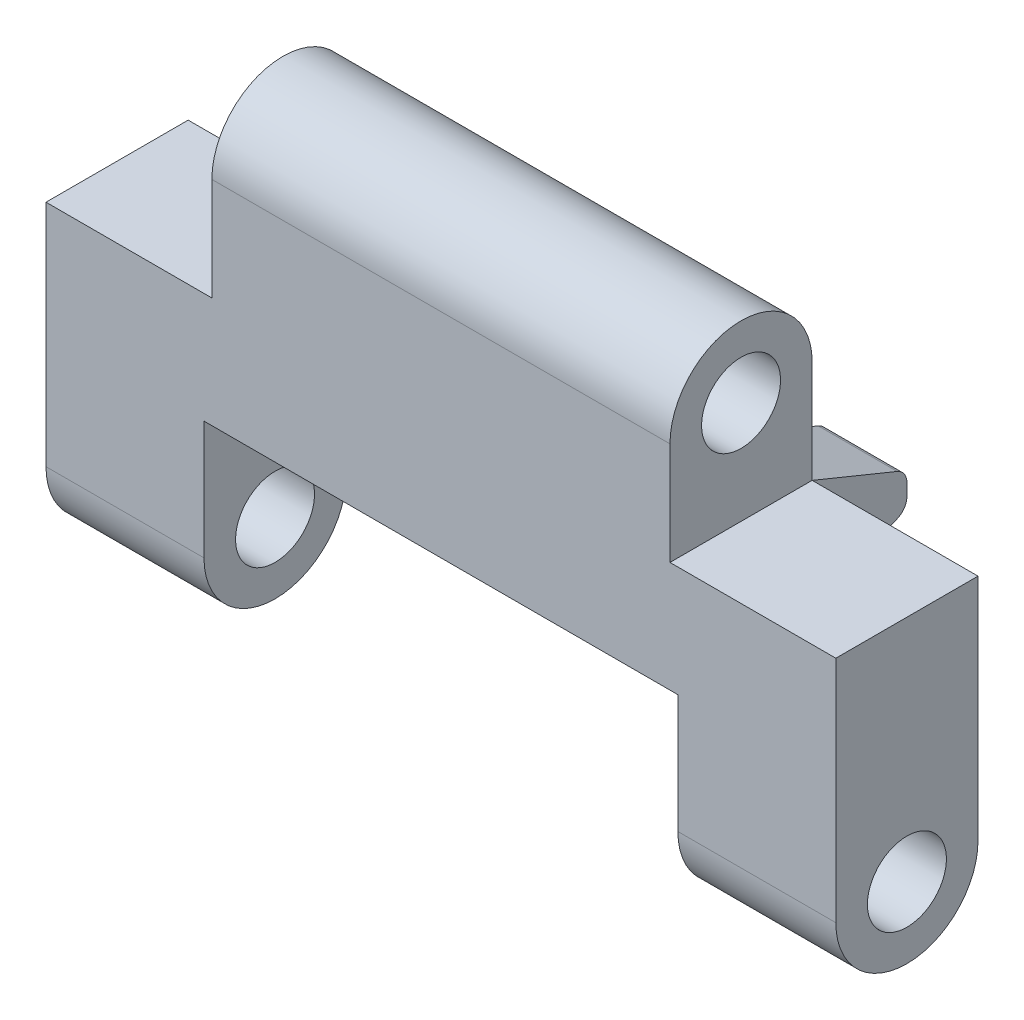
ISO-10303-21;
HEADER;
FILE_DESCRIPTION(('STEP AP214'),'2;1');
FILE_NAME('part.step','',(''),(''),'','','');
FILE_SCHEMA(('AUTOMOTIVE_DESIGN { 1 0 10303 214 1 1 1 1 }'));
ENDSEC;
DATA;
#1=APPLICATION_CONTEXT('core data for automotive mechanical design processes');
#2=APPLICATION_PROTOCOL_DEFINITION('international standard','automotive_design',2000,#1);
#3=PRODUCT_CONTEXT('',#1,'mechanical');
#4=PRODUCT('Part','Part','',(#3));
#5=PRODUCT_RELATED_PRODUCT_CATEGORY('part','',(#4));
#6=PRODUCT_DEFINITION_FORMATION('','',#4);
#7=PRODUCT_DEFINITION_CONTEXT('part definition',#1,'design');
#8=PRODUCT_DEFINITION('design','',#6,#7);
#9=PRODUCT_DEFINITION_SHAPE('','',#8);
#10=(LENGTH_UNIT() NAMED_UNIT(*) SI_UNIT(.MILLI.,.METRE.));
#11=(NAMED_UNIT(*) PLANE_ANGLE_UNIT() SI_UNIT($,.RADIAN.));
#12=(NAMED_UNIT(*) SI_UNIT($,.STERADIAN.) SOLID_ANGLE_UNIT());
#13=UNCERTAINTY_MEASURE_WITH_UNIT(LENGTH_MEASURE(1.E-05),#10,'distance_accuracy_value','');
#14=(GEOMETRIC_REPRESENTATION_CONTEXT(3) GLOBAL_UNCERTAINTY_ASSIGNED_CONTEXT((#13)) GLOBAL_UNIT_ASSIGNED_CONTEXT((#10,
#11,#12)) REPRESENTATION_CONTEXT('',''));
#15=CARTESIAN_POINT('',(0.,0.,0.));
#16=DIRECTION('',(0.,0.,1.));
#17=DIRECTION('',(1.,0.,0.));
#18=AXIS2_PLACEMENT_3D('',#15,#16,#17);
#19=CARTESIAN_POINT('',(0.,-19.,9.));
#20=DIRECTION('',(1.,0.,0.));
#21=DIRECTION('',(0.,0.,-1.));
#22=AXIS2_PLACEMENT_3D('',#19,#20,#21);
#23=PLANE('',#22);
#24=CARTESIAN_POINT('',(0.,-14.5,4.5));
#25=DIRECTION('',(-1.,0.,0.));
#26=DIRECTION('',(0.,0.,1.));
#27=AXIS2_PLACEMENT_3D('',#24,#25,#26);
#28=CIRCLE('',#27,2.5);
#29=CARTESIAN_POINT('',(0.,-14.5,7.));
#30=VERTEX_POINT('',#29);
#31=EDGE_CURVE('E255',#30,#30,#28,.T.);
#32=ORIENTED_EDGE('',*,*,#31,.F.);
#33=EDGE_LOOP('',(#32));
#34=FACE_BOUND('',#33,.T.);
#35=DIRECTION('',(0.,-1.,0.));
#36=VECTOR('',#35,1.);
#37=CARTESIAN_POINT('',(0.,-19.,0.));
#38=LINE('',#37,#36);
#39=CARTESIAN_POINT('',(0.,0.,0.));
#40=VERTEX_POINT('',#39);
#41=CARTESIAN_POINT('',(0.,-14.5,0.));
#42=VERTEX_POINT('',#41);
#43=EDGE_CURVE('E295',#40,#42,#38,.T.);
#44=ORIENTED_EDGE('',*,*,#43,.T.);
#45=CARTESIAN_POINT('',(0.,-14.5,4.5));
#46=DIRECTION('',(1.,0.,0.));
#47=DIRECTION('',(0.,0.,-1.));
#48=AXIS2_PLACEMENT_3D('',#45,#46,#47);
#49=CIRCLE('',#48,4.5);
#50=CARTESIAN_POINT('',(0.,-14.5,9.));
#51=VERTEX_POINT('',#50);
#52=EDGE_CURVE('E317',#42,#51,#49,.F.);
#53=ORIENTED_EDGE('',*,*,#52,.T.);
#54=DIRECTION('',(0.,-1.,0.));
#55=VECTOR('',#54,1.);
#56=CARTESIAN_POINT('',(0.,-19.,9.));
#57=LINE('',#56,#55);
#58=CARTESIAN_POINT('',(0.,0.,9.));
#59=VERTEX_POINT('',#58);
#60=EDGE_CURVE('E231',#59,#51,#57,.T.);
#61=ORIENTED_EDGE('',*,*,#60,.F.);
#62=DIRECTION('',(0.,0.,-1.));
#63=VECTOR('',#62,1.);
#64=CARTESIAN_POINT('',(0.,0.,9.));
#65=LINE('',#64,#63);
#66=EDGE_CURVE('E232',#59,#40,#65,.T.);
#67=ORIENTED_EDGE('',*,*,#66,.T.);
#68=EDGE_LOOP('',(#44,#53,#61,#67));
#69=FACE_BOUND('',#68,.T.);
#70=ADVANCED_FACE('F34',(#34,#69),#23,.F.);
#71=CARTESIAN_POINT('',(10.,-7.,9.));
#72=DIRECTION('',(-1.,0.,0.));
#73=DIRECTION('',(0.,-1.,0.));
#74=AXIS2_PLACEMENT_3D('',#71,#72,#73);
#75=PLANE('',#74);
#76=CARTESIAN_POINT('',(9.99999999999999,-14.5,4.5));
#77=DIRECTION('',(-1.,0.,0.));
#78=DIRECTION('',(0.,-1.,0.));
#79=AXIS2_PLACEMENT_3D('',#76,#77,#78);
#80=CIRCLE('',#79,2.5);
#81=CARTESIAN_POINT('',(9.99999999999999,-17.,4.5));
#82=VERTEX_POINT('',#81);
#83=EDGE_CURVE('E299',#82,#82,#80,.T.);
#84=ORIENTED_EDGE('',*,*,#83,.T.);
#85=EDGE_LOOP('',(#84));
#86=FACE_BOUND('',#85,.T.);
#87=DIRECTION('',(0.,1.,0.));
#88=VECTOR('',#87,1.);
#89=CARTESIAN_POINT('',(10.,-7.,9.));
#90=LINE('',#89,#88);
#91=CARTESIAN_POINT('',(10.,-14.5,9.));
#92=VERTEX_POINT('',#91);
#93=CARTESIAN_POINT('',(10.,-7.,9.));
#94=VERTEX_POINT('',#93);
#95=EDGE_CURVE('E285',#92,#94,#90,.T.);
#96=ORIENTED_EDGE('',*,*,#95,.F.);
#97=CARTESIAN_POINT('',(10.,-14.5,4.5));
#98=DIRECTION('',(-1.,0.,0.));
#99=DIRECTION('',(0.,-1.,0.));
#100=AXIS2_PLACEMENT_3D('',#97,#98,#99);
#101=CIRCLE('',#100,4.5);
#102=CARTESIAN_POINT('',(10.,-14.5,0.));
#103=VERTEX_POINT('',#102);
#104=EDGE_CURVE('E313',#92,#103,#101,.F.);
#105=ORIENTED_EDGE('',*,*,#104,.T.);
#106=DIRECTION('',(0.,1.,0.));
#107=VECTOR('',#106,1.);
#108=CARTESIAN_POINT('',(10.,-7.,0.));
#109=LINE('',#108,#107);
#110=CARTESIAN_POINT('',(10.,-7.,0.));
#111=VERTEX_POINT('',#110);
#112=EDGE_CURVE('E298',#103,#111,#109,.T.);
#113=ORIENTED_EDGE('',*,*,#112,.T.);
#114=DIRECTION('',(0.,0.,-1.));
#115=VECTOR('',#114,1.);
#116=CARTESIAN_POINT('',(10.,-7.,9.));
#117=LINE('',#116,#115);
#118=EDGE_CURVE('E247',#94,#111,#117,.T.);
#119=ORIENTED_EDGE('',*,*,#118,.F.);
#120=EDGE_LOOP('',(#96,#105,#113,#119));
#121=FACE_BOUND('',#120,.T.);
#122=ADVANCED_FACE('F417',(#86,#121),#75,.F.);
#123=CARTESIAN_POINT('',(40.,-19.,9.));
#124=DIRECTION('',(1.,0.,0.));
#125=DIRECTION('',(0.,1.,0.));
#126=AXIS2_PLACEMENT_3D('',#123,#124,#125);
#127=PLANE('',#126);
#128=CARTESIAN_POINT('',(40.,-14.5,4.5));
#129=DIRECTION('',(1.,0.,0.));
#130=DIRECTION('',(0.,1.,0.));
#131=AXIS2_PLACEMENT_3D('',#128,#129,#130);
#132=CIRCLE('',#131,2.5);
#133=CARTESIAN_POINT('',(40.,-12.,4.5));
#134=VERTEX_POINT('',#133);
#135=EDGE_CURVE('E259',#134,#134,#132,.T.);
#136=ORIENTED_EDGE('',*,*,#135,.T.);
#137=EDGE_LOOP('',(#136));
#138=FACE_BOUND('',#137,.T.);
#139=DIRECTION('',(0.,-1.,0.));
#140=VECTOR('',#139,1.);
#141=CARTESIAN_POINT('',(40.,-19.,0.));
#142=LINE('',#141,#140);
#143=CARTESIAN_POINT('',(40.,-6.99999999999999,0.));
#144=VERTEX_POINT('',#143);
#145=CARTESIAN_POINT('',(40.,-14.5,0.));
#146=VERTEX_POINT('',#145);
#147=EDGE_CURVE('E217',#144,#146,#142,.T.);
#148=ORIENTED_EDGE('',*,*,#147,.T.);
#149=CARTESIAN_POINT('',(40.,-14.5,4.5));
#150=DIRECTION('',(1.,0.,0.));
#151=DIRECTION('',(0.,1.,0.));
#152=AXIS2_PLACEMENT_3D('',#149,#150,#151);
#153=CIRCLE('',#152,4.5);
#154=CARTESIAN_POINT('',(40.,-14.5,9.));
#155=VERTEX_POINT('',#154);
#156=EDGE_CURVE('E206',#146,#155,#153,.F.);
#157=ORIENTED_EDGE('',*,*,#156,.T.);
#158=DIRECTION('',(0.,-1.,0.));
#159=VECTOR('',#158,1.);
#160=CARTESIAN_POINT('',(40.,-19.,9.));
#161=LINE('',#160,#159);
#162=CARTESIAN_POINT('',(40.,-6.99999999999999,9.));
#163=VERTEX_POINT('',#162);
#164=EDGE_CURVE('E277',#163,#155,#161,.T.);
#165=ORIENTED_EDGE('',*,*,#164,.F.);
#166=DIRECTION('',(0.,0.,-1.));
#167=VECTOR('',#166,1.);
#168=CARTESIAN_POINT('',(40.,-6.99999999999999,9.));
#169=LINE('',#168,#167);
#170=EDGE_CURVE('E244',#163,#144,#169,.T.);
#171=ORIENTED_EDGE('',*,*,#170,.T.);
#172=EDGE_LOOP('',(#148,#157,#165,#171));
#173=FACE_BOUND('',#172,.T.);
#174=ADVANCED_FACE('F312',(#138,#173),#127,.F.);
#175=CARTESIAN_POINT('',(50.,0.,9.));
#176=DIRECTION('',(-1.,0.,0.));
#177=DIRECTION('',(0.,0.,1.));
#178=AXIS2_PLACEMENT_3D('',#175,#176,#177);
#179=PLANE('',#178);
#180=CARTESIAN_POINT('',(50.,-14.5,4.5));
#181=DIRECTION('',(-1.,0.,0.));
#182=DIRECTION('',(0.,0.,1.));
#183=AXIS2_PLACEMENT_3D('',#180,#181,#182);
#184=CIRCLE('',#183,2.5);
#185=CARTESIAN_POINT('',(50.,-14.5,7.));
#186=VERTEX_POINT('',#185);
#187=EDGE_CURVE('E256',#186,#186,#184,.T.);
#188=ORIENTED_EDGE('',*,*,#187,.T.);
#189=EDGE_LOOP('',(#188));
#190=FACE_BOUND('',#189,.T.);
#191=DIRECTION('',(0.,1.,0.));
#192=VECTOR('',#191,1.);
#193=CARTESIAN_POINT('',(50.,0.,9.));
#194=LINE('',#193,#192);
#195=CARTESIAN_POINT('',(50.,-14.5,9.));
#196=VERTEX_POINT('',#195);
#197=CARTESIAN_POINT('',(50.,0.,9.));
#198=VERTEX_POINT('',#197);
#199=EDGE_CURVE('E200',#196,#198,#194,.T.);
#200=ORIENTED_EDGE('',*,*,#199,.F.);
#201=CARTESIAN_POINT('',(50.,-14.5,4.5));
#202=DIRECTION('',(-1.,0.,0.));
#203=DIRECTION('',(0.,0.,-1.));
#204=AXIS2_PLACEMENT_3D('',#201,#202,#203);
#205=CIRCLE('',#204,4.5);
#206=CARTESIAN_POINT('',(50.,-14.5,0.));
#207=VERTEX_POINT('',#206);
#208=EDGE_CURVE('E56',#207,#196,#205,.T.);
#209=ORIENTED_EDGE('',*,*,#208,.F.);
#210=DIRECTION('',(0.,1.,0.));
#211=VECTOR('',#210,1.);
#212=CARTESIAN_POINT('',(50.,0.,0.));
#213=LINE('',#212,#211);
#214=CARTESIAN_POINT('',(50.,0.,0.));
#215=VERTEX_POINT('',#214);
#216=EDGE_CURVE('E198',#207,#215,#213,.T.);
#217=ORIENTED_EDGE('',*,*,#216,.T.);
#218=DIRECTION('',(0.,0.,-1.));
#219=VECTOR('',#218,1.);
#220=CARTESIAN_POINT('',(50.,0.,9.));
#221=LINE('',#220,#219);
#222=EDGE_CURVE('E242',#198,#215,#221,.T.);
#223=ORIENTED_EDGE('',*,*,#222,.F.);
#224=EDGE_LOOP('',(#200,#209,#217,#223));
#225=FACE_BOUND('',#224,.T.);
#226=ADVANCED_FACE('F195',(#190,#225),#179,.F.);
#227=CARTESIAN_POINT('',(39.5,11.,9.));
#228=DIRECTION('',(-1.,0.,0.));
#229=DIRECTION('',(0.,0.,1.));
#230=AXIS2_PLACEMENT_3D('',#227,#228,#229);
#231=PLANE('',#230);
#232=CARTESIAN_POINT('',(39.5,6.5,4.5));
#233=DIRECTION('',(-1.,0.,0.));
#234=DIRECTION('',(0.,0.,1.));
#235=AXIS2_PLACEMENT_3D('',#232,#233,#234);
#236=CIRCLE('',#235,2.5);
#237=CARTESIAN_POINT('',(39.5,6.5,7.));
#238=VERTEX_POINT('',#237);
#239=EDGE_CURVE('E254',#238,#238,#236,.T.);
#240=ORIENTED_EDGE('',*,*,#239,.T.);
#241=EDGE_LOOP('',(#240));
#242=FACE_BOUND('',#241,.T.);
#243=DIRECTION('',(0.,1.,0.));
#244=VECTOR('',#243,1.);
#245=CARTESIAN_POINT('',(39.5,11.,0.));
#246=LINE('',#245,#244);
#247=CARTESIAN_POINT('',(39.5,0.,0.));
#248=VERTEX_POINT('',#247);
#249=CARTESIAN_POINT('',(39.5,6.5,0.));
#250=VERTEX_POINT('',#249);
#251=EDGE_CURVE('E219',#248,#250,#246,.T.);
#252=ORIENTED_EDGE('',*,*,#251,.T.);
#253=CARTESIAN_POINT('',(39.5,6.5,4.5));
#254=DIRECTION('',(-1.,0.,0.));
#255=DIRECTION('',(0.,0.,1.));
#256=AXIS2_PLACEMENT_3D('',#253,#254,#255);
#257=CIRCLE('',#256,4.5);
#258=CARTESIAN_POINT('',(39.5,6.5,9.));
#259=VERTEX_POINT('',#258);
#260=EDGE_CURVE('E314',#250,#259,#257,.F.);
#261=ORIENTED_EDGE('',*,*,#260,.T.);
#262=DIRECTION('',(0.,1.,0.));
#263=VECTOR('',#262,1.);
#264=CARTESIAN_POINT('',(39.5,11.,9.));
#265=LINE('',#264,#263);
#266=CARTESIAN_POINT('',(39.5,0.,9.));
#267=VERTEX_POINT('',#266);
#268=EDGE_CURVE('E290',#267,#259,#265,.T.);
#269=ORIENTED_EDGE('',*,*,#268,.F.);
#270=DIRECTION('',(0.,0.,-1.));
#271=VECTOR('',#270,1.);
#272=CARTESIAN_POINT('',(39.5,0.,9.));
#273=LINE('',#272,#271);
#274=EDGE_CURVE('E239',#267,#248,#273,.T.);
#275=ORIENTED_EDGE('',*,*,#274,.T.);
#276=EDGE_LOOP('',(#252,#261,#269,#275));
#277=FACE_BOUND('',#276,.T.);
#278=ADVANCED_FACE('F471',(#242,#277),#231,.F.);
#279=CARTESIAN_POINT('',(10.5,0.,9.));
#280=DIRECTION('',(1.,0.,0.));
#281=DIRECTION('',(0.,1.,0.));
#282=AXIS2_PLACEMENT_3D('',#279,#280,#281);
#283=PLANE('',#282);
#284=CARTESIAN_POINT('',(10.5,6.5,4.5));
#285=DIRECTION('',(1.,0.,0.));
#286=DIRECTION('',(0.,1.,0.));
#287=AXIS2_PLACEMENT_3D('',#284,#285,#286);
#288=CIRCLE('',#287,2.5);
#289=CARTESIAN_POINT('',(10.5,9.,4.5));
#290=VERTEX_POINT('',#289);
#291=EDGE_CURVE('E251',#290,#290,#288,.T.);
#292=ORIENTED_EDGE('',*,*,#291,.T.);
#293=EDGE_LOOP('',(#292));
#294=FACE_BOUND('',#293,.T.);
#295=DIRECTION('',(0.,-1.,0.));
#296=VECTOR('',#295,1.);
#297=CARTESIAN_POINT('',(10.5,0.,9.));
#298=LINE('',#297,#296);
#299=CARTESIAN_POINT('',(10.5,6.5,9.));
#300=VERTEX_POINT('',#299);
#301=CARTESIAN_POINT('',(10.5,0.,9.));
#302=VERTEX_POINT('',#301);
#303=EDGE_CURVE('E292',#300,#302,#298,.T.);
#304=ORIENTED_EDGE('',*,*,#303,.F.);
#305=CARTESIAN_POINT('',(10.5,6.5,4.5));
#306=DIRECTION('',(1.,0.,0.));
#307=DIRECTION('',(0.,1.,0.));
#308=AXIS2_PLACEMENT_3D('',#305,#306,#307);
#309=CIRCLE('',#308,4.5);
#310=CARTESIAN_POINT('',(10.5,6.5,0.));
#311=VERTEX_POINT('',#310);
#312=EDGE_CURVE('E48',#300,#311,#309,.F.);
#313=ORIENTED_EDGE('',*,*,#312,.T.);
#314=DIRECTION('',(0.,-1.,0.));
#315=VECTOR('',#314,1.);
#316=CARTESIAN_POINT('',(10.5,0.,0.));
#317=LINE('',#316,#315);
#318=CARTESIAN_POINT('',(10.5,0.,0.));
#319=VERTEX_POINT('',#318);
#320=EDGE_CURVE('E227',#311,#319,#317,.T.);
#321=ORIENTED_EDGE('',*,*,#320,.T.);
#322=DIRECTION('',(0.,0.,-1.));
#323=VECTOR('',#322,1.);
#324=CARTESIAN_POINT('',(10.5,0.,9.));
#325=LINE('',#324,#323);
#326=EDGE_CURVE('E235',#302,#319,#325,.T.);
#327=ORIENTED_EDGE('',*,*,#326,.F.);
#328=EDGE_LOOP('',(#304,#313,#321,#327));
#329=FACE_BOUND('',#328,.T.);
#330=ADVANCED_FACE('F501',(#294,#329),#283,.F.);
#331=CARTESIAN_POINT('',(0.,0.,-6.));
#332=DIRECTION('',(0.,0.,1.));
#333=DIRECTION('',(1.,0.,0.));
#334=AXIS2_PLACEMENT_3D('',#331,#332,#333);
#335=PLANE('',#334);
#336=DIRECTION('',(0.,-1.,0.));
#337=VECTOR('',#336,1.);
#338=CARTESIAN_POINT('',(15.501,0.,-6.));
#339=LINE('',#338,#337);
#340=CARTESIAN_POINT('',(15.501,-3.125566850011,-6.));
#341=VERTEX_POINT('',#340);
#342=CARTESIAN_POINT('',(15.501,-3.874433149989,-6.));
#343=VERTEX_POINT('',#342);
#344=EDGE_CURVE('E395',#341,#343,#339,.T.);
#345=ORIENTED_EDGE('',*,*,#344,.T.);
#346=DIRECTION('',(1.,0.,0.));
#347=VECTOR('',#346,1.);
#348=CARTESIAN_POINT('',(9.50099999999999,-3.874433149989,-6.));
#349=LINE('',#348,#347);
#350=CARTESIAN_POINT('',(10.501,-3.874433149989,-6.));
#351=VERTEX_POINT('',#350);
#352=EDGE_CURVE('E339',#351,#343,#349,.T.);
#353=ORIENTED_EDGE('',*,*,#352,.F.);
#354=DIRECTION('',(0.,1.,0.));
#355=VECTOR('',#354,1.);
#356=CARTESIAN_POINT('',(10.501,0.,-6.));
#357=LINE('',#356,#355);
#358=CARTESIAN_POINT('',(10.501,-3.12556685001099,-6.));
#359=VERTEX_POINT('',#358);
#360=EDGE_CURVE('E392',#351,#359,#357,.T.);
#361=ORIENTED_EDGE('',*,*,#360,.T.);
#362=DIRECTION('',(1.,0.,0.));
#363=VECTOR('',#362,1.);
#364=CARTESIAN_POINT('',(9.50099999999999,-3.12556685001099,-6.));
#365=LINE('',#364,#363);
#366=EDGE_CURVE('E341',#359,#341,#365,.T.);
#367=ORIENTED_EDGE('',*,*,#366,.T.);
#368=EDGE_LOOP('',(#345,#353,#361,#367));
#369=FACE_BOUND('',#368,.T.);
#370=ADVANCED_FACE('F439',(#369),#335,.F.);
#371=CARTESIAN_POINT('',(0.,0.,-6.));
#372=DIRECTION('',(0.,0.,1.));
#373=DIRECTION('',(1.,0.,0.));
#374=AXIS2_PLACEMENT_3D('',#371,#372,#373);
#375=PLANE('',#374);
#376=DIRECTION('',(0.,-1.,0.));
#377=VECTOR('',#376,1.);
#378=CARTESIAN_POINT('',(39.501,-6.99999999999999,-6.));
#379=LINE('',#378,#377);
#380=CARTESIAN_POINT('',(39.501,-3.12556685001099,-6.));
#381=VERTEX_POINT('',#380);
#382=CARTESIAN_POINT('',(39.501,-3.874433149989,-6.));
#383=VERTEX_POINT('',#382);
#384=EDGE_CURVE('E379',#381,#383,#379,.T.);
#385=ORIENTED_EDGE('',*,*,#384,.T.);
#386=DIRECTION('',(1.,0.,0.));
#387=VECTOR('',#386,1.);
#388=CARTESIAN_POINT('',(9.50099999999999,-3.874433149989,-6.));
#389=LINE('',#388,#387);
#390=CARTESIAN_POINT('',(34.501,-3.874433149989,-6.));
#391=VERTEX_POINT('',#390);
#392=EDGE_CURVE('E261',#383,#391,#389,.F.);
#393=ORIENTED_EDGE('',*,*,#392,.T.);
#394=DIRECTION('',(0.,1.,0.));
#395=VECTOR('',#394,1.);
#396=CARTESIAN_POINT('',(34.501,-6.99999999999999,-6.));
#397=LINE('',#396,#395);
#398=CARTESIAN_POINT('',(34.501,-3.12556685001099,-6.));
#399=VERTEX_POINT('',#398);
#400=EDGE_CURVE('E382',#391,#399,#397,.T.);
#401=ORIENTED_EDGE('',*,*,#400,.T.);
#402=DIRECTION('',(1.,0.,0.));
#403=VECTOR('',#402,1.);
#404=CARTESIAN_POINT('',(9.50099999999999,-3.12556685001099,-6.));
#405=LINE('',#404,#403);
#406=EDGE_CURVE('E250',#381,#399,#405,.F.);
#407=ORIENTED_EDGE('',*,*,#406,.F.);
#408=EDGE_LOOP('',(#385,#393,#401,#407));
#409=FACE_BOUND('',#408,.T.);
#410=ADVANCED_FACE('F535',(#409),#375,.F.);
#411=CARTESIAN_POINT('',(0.,0.,0.));
#412=DIRECTION('',(0.,0.,-1.));
#413=DIRECTION('',(-1.,0.,0.));
#414=AXIS2_PLACEMENT_3D('',#411,#412,#413);
#415=PLANE('',#414);
#416=DIRECTION('',(1.,0.,0.));
#417=VECTOR('',#416,1.);
#418=CARTESIAN_POINT('',(-10.,-14.5,0.));
#419=LINE('',#418,#417);
#420=EDGE_CURVE('E201',#146,#207,#419,.T.);
#421=ORIENTED_EDGE('',*,*,#420,.F.);
#422=ORIENTED_EDGE('',*,*,#147,.F.);
#423=DIRECTION('',(1.,0.,0.));
#424=VECTOR('',#423,1.);
#425=CARTESIAN_POINT('',(40.,-6.99999999999999,0.));
#426=LINE('',#425,#424);
#427=CARTESIAN_POINT('',(39.501,-6.99999999999999,0.));
#428=VERTEX_POINT('',#427);
#429=EDGE_CURVE('E300',#428,#144,#426,.T.);
#430=ORIENTED_EDGE('',*,*,#429,.F.);
#431=DIRECTION('',(0.,-1.,0.));
#432=VECTOR('',#431,1.);
#433=CARTESIAN_POINT('',(39.501,-6.99999999999999,0.));
#434=LINE('',#433,#432);
#435=CARTESIAN_POINT('',(39.501,0.,0.));
#436=VERTEX_POINT('',#435);
#437=EDGE_CURVE('E378',#436,#428,#434,.T.);
#438=ORIENTED_EDGE('',*,*,#437,.F.);
#439=DIRECTION('',(-1.,0.,0.));
#440=VECTOR('',#439,1.);
#441=CARTESIAN_POINT('',(39.5,0.,0.));
#442=LINE('',#441,#440);
#443=EDGE_CURVE('E216',#215,#436,#442,.T.);
#444=ORIENTED_EDGE('',*,*,#443,.F.);
#445=ORIENTED_EDGE('',*,*,#216,.F.);
#446=EDGE_LOOP('',(#421,#422,#430,#438,#444,#445));
#447=FACE_BOUND('',#446,.T.);
#448=ADVANCED_FACE('F213',(#447),#415,.T.);
#449=EDGE_CURVE('E210',#42,#103,#419,.T.);
#450=ORIENTED_EDGE('',*,*,#449,.F.);
#451=ORIENTED_EDGE('',*,*,#43,.F.);
#452=DIRECTION('',(-1.,0.,0.));
#453=VECTOR('',#452,1.);
#454=CARTESIAN_POINT('',(0.,0.,0.));
#455=LINE('',#454,#453);
#456=EDGE_CURVE('E229',#319,#40,#455,.T.);
#457=ORIENTED_EDGE('',*,*,#456,.F.);
#458=ORIENTED_EDGE('',*,*,#320,.F.);
#459=DIRECTION('',(1.,0.,0.));
#460=VECTOR('',#459,1.);
#461=CARTESIAN_POINT('',(-10.,6.5,0.));
#462=LINE('',#461,#460);
#463=EDGE_CURVE('E202',#311,#250,#462,.T.);
#464=ORIENTED_EDGE('',*,*,#463,.T.);
#465=ORIENTED_EDGE('',*,*,#251,.F.);
#466=DIRECTION('',(1.,0.,0.));
#467=VECTOR('',#466,1.);
#468=CARTESIAN_POINT('',(39.501,0.,0.));
#469=LINE('',#468,#467);
#470=CARTESIAN_POINT('',(34.501,0.,0.));
#471=VERTEX_POINT('',#470);
#472=EDGE_CURVE('E383',#471,#248,#469,.T.);
#473=ORIENTED_EDGE('',*,*,#472,.F.);
#474=DIRECTION('',(0.,1.,0.));
#475=VECTOR('',#474,1.);
#476=CARTESIAN_POINT('',(34.501,-6.99999999999999,0.));
#477=LINE('',#476,#475);
#478=CARTESIAN_POINT('',(34.501,-6.99999999999999,0.));
#479=VERTEX_POINT('',#478);
#480=EDGE_CURVE('E388',#479,#471,#477,.T.);
#481=ORIENTED_EDGE('',*,*,#480,.F.);
#482=CARTESIAN_POINT('',(15.501,-6.99999999999999,0.));
#483=VERTEX_POINT('',#482);
#484=EDGE_CURVE('E302',#483,#479,#426,.T.);
#485=ORIENTED_EDGE('',*,*,#484,.F.);
#486=DIRECTION('',(0.,-1.,0.));
#487=VECTOR('',#486,1.);
#488=CARTESIAN_POINT('',(15.501,0.,0.));
#489=LINE('',#488,#487);
#490=CARTESIAN_POINT('',(15.501,0.,0.));
#491=VERTEX_POINT('',#490);
#492=EDGE_CURVE('E396',#491,#483,#489,.T.);
#493=ORIENTED_EDGE('',*,*,#492,.F.);
#494=DIRECTION('',(1.,0.,0.));
#495=VECTOR('',#494,1.);
#496=CARTESIAN_POINT('',(10.501,0.,0.));
#497=LINE('',#496,#495);
#498=CARTESIAN_POINT('',(10.501,0.,0.));
#499=VERTEX_POINT('',#498);
#500=EDGE_CURVE('E401',#499,#491,#497,.T.);
#501=ORIENTED_EDGE('',*,*,#500,.F.);
#502=DIRECTION('',(0.,1.,0.));
#503=VECTOR('',#502,1.);
#504=CARTESIAN_POINT('',(10.501,0.,0.));
#505=LINE('',#504,#503);
#506=CARTESIAN_POINT('',(10.501,-6.99999999999999,0.));
#507=VERTEX_POINT('',#506);
#508=EDGE_CURVE('E386',#507,#499,#505,.T.);
#509=ORIENTED_EDGE('',*,*,#508,.F.);
#510=EDGE_CURVE('E221',#111,#507,#426,.T.);
#511=ORIENTED_EDGE('',*,*,#510,.F.);
#512=ORIENTED_EDGE('',*,*,#112,.F.);
#513=EDGE_LOOP('',(#450,#451,#457,#458,#464,#465,#473,#481,#485,#493,#501,#509,#511,#512));
#514=FACE_BOUND('',#513,.T.);
#515=ADVANCED_FACE('F422',(#514),#415,.T.);
#516=CARTESIAN_POINT('',(40.,-6.99999999999999,9.));
#517=DIRECTION('',(0.,1.,0.));
#518=DIRECTION('',(-1.,0.,0.));
#519=AXIS2_PLACEMENT_3D('',#516,#517,#518);
#520=PLANE('',#519);
#521=ORIENTED_EDGE('',*,*,#510,.T.);
#522=DIRECTION('',(1.,0.,0.));
#523=VECTOR('',#522,1.);
#524=CARTESIAN_POINT('',(9.50099999999999,-6.99999999999999,0.));
#525=LINE('',#524,#523);
#526=EDGE_CURVE('E335',#507,#483,#525,.T.);
#527=ORIENTED_EDGE('',*,*,#526,.T.);
#528=ORIENTED_EDGE('',*,*,#484,.T.);
#529=EDGE_CURVE('E310',#479,#428,#525,.T.);
#530=ORIENTED_EDGE('',*,*,#529,.T.);
#531=ORIENTED_EDGE('',*,*,#429,.T.);
#532=ORIENTED_EDGE('',*,*,#170,.F.);
#533=DIRECTION('',(1.,0.,0.));
#534=VECTOR('',#533,1.);
#535=CARTESIAN_POINT('',(40.,-6.99999999999999,9.));
#536=LINE('',#535,#534);
#537=EDGE_CURVE('E279',#94,#163,#536,.T.);
#538=ORIENTED_EDGE('',*,*,#537,.F.);
#539=ORIENTED_EDGE('',*,*,#118,.T.);
#540=EDGE_LOOP('',(#521,#527,#528,#530,#531,#532,#538,#539));
#541=FACE_BOUND('',#540,.T.);
#542=ADVANCED_FACE('F309',(#541),#520,.F.);
#543=CARTESIAN_POINT('',(39.5,0.,9.));
#544=DIRECTION('',(0.,-1.,0.));
#545=DIRECTION('',(0.,0.,-1.));
#546=AXIS2_PLACEMENT_3D('',#543,#544,#545);
#547=PLANE('',#546);
#548=ORIENTED_EDGE('',*,*,#443,.T.);
#549=DIRECTION('',(1.,0.,0.));
#550=VECTOR('',#549,1.);
#551=CARTESIAN_POINT('',(9.50099999999999,0.,0.));
#552=LINE('',#551,#550);
#553=EDGE_CURVE('E333',#248,#436,#552,.T.);
#554=ORIENTED_EDGE('',*,*,#553,.F.);
#555=ORIENTED_EDGE('',*,*,#274,.F.);
#556=DIRECTION('',(-1.,0.,0.));
#557=VECTOR('',#556,1.);
#558=CARTESIAN_POINT('',(39.5,0.,9.));
#559=LINE('',#558,#557);
#560=EDGE_CURVE('E283',#198,#267,#559,.T.);
#561=ORIENTED_EDGE('',*,*,#560,.F.);
#562=ORIENTED_EDGE('',*,*,#222,.T.);
#563=EDGE_LOOP('',(#548,#554,#555,#561,#562));
#564=FACE_BOUND('',#563,.T.);
#565=ADVANCED_FACE('F466',(#564),#547,.F.);
#566=CARTESIAN_POINT('',(0.,0.,9.));
#567=DIRECTION('',(0.,-1.,0.));
#568=DIRECTION('',(0.,0.,-1.));
#569=AXIS2_PLACEMENT_3D('',#566,#567,#568);
#570=PLANE('',#569);
#571=ORIENTED_EDGE('',*,*,#456,.T.);
#572=ORIENTED_EDGE('',*,*,#66,.F.);
#573=DIRECTION('',(-1.,0.,0.));
#574=VECTOR('',#573,1.);
#575=CARTESIAN_POINT('',(0.,0.,9.));
#576=LINE('',#575,#574);
#577=EDGE_CURVE('E236',#302,#59,#576,.T.);
#578=ORIENTED_EDGE('',*,*,#577,.F.);
#579=ORIENTED_EDGE('',*,*,#326,.T.);
#580=EDGE_LOOP('',(#571,#572,#578,#579));
#581=FACE_BOUND('',#580,.T.);
#582=ADVANCED_FACE('F504',(#581),#570,.F.);
#583=CARTESIAN_POINT('',(0.,0.,9.));
#584=DIRECTION('',(0.,0.,-1.));
#585=DIRECTION('',(-1.,0.,0.));
#586=AXIS2_PLACEMENT_3D('',#583,#584,#585);
#587=PLANE('',#586);
#588=ORIENTED_EDGE('',*,*,#60,.T.);
#589=DIRECTION('',(1.,0.,0.));
#590=VECTOR('',#589,1.);
#591=CARTESIAN_POINT('',(0.,-14.5,9.));
#592=LINE('',#591,#590);
#593=EDGE_CURVE('E11',#51,#92,#592,.T.);
#594=ORIENTED_EDGE('',*,*,#593,.T.);
#595=ORIENTED_EDGE('',*,*,#95,.T.);
#596=ORIENTED_EDGE('',*,*,#537,.T.);
#597=ORIENTED_EDGE('',*,*,#164,.T.);
#598=EDGE_CURVE('E37',#155,#196,#592,.T.);
#599=ORIENTED_EDGE('',*,*,#598,.T.);
#600=ORIENTED_EDGE('',*,*,#199,.T.);
#601=ORIENTED_EDGE('',*,*,#560,.T.);
#602=ORIENTED_EDGE('',*,*,#268,.T.);
#603=DIRECTION('',(-1.,0.,0.));
#604=VECTOR('',#603,1.);
#605=CARTESIAN_POINT('',(0.,6.5,9.));
#606=LINE('',#605,#604);
#607=EDGE_CURVE('E269',#259,#300,#606,.T.);
#608=ORIENTED_EDGE('',*,*,#607,.T.);
#609=ORIENTED_EDGE('',*,*,#303,.T.);
#610=ORIENTED_EDGE('',*,*,#577,.T.);
#611=EDGE_LOOP('',(#588,#594,#595,#596,#597,#599,#600,#601,#602,#608,#609,#610));
#612=FACE_BOUND('',#611,.T.);
#613=ADVANCED_FACE('F275',(#612),#587,.F.);
#614=CARTESIAN_POINT('',(56.,6.5,4.5));
#615=DIRECTION('',(-1.,0.,0.));
#616=DIRECTION('',(0.,0.,1.));
#617=AXIS2_PLACEMENT_3D('',#614,#615,#616);
#618=CYLINDRICAL_SURFACE('',#617,2.5);
#619=ORIENTED_EDGE('',*,*,#291,.F.);
#620=EDGE_LOOP('',(#619));
#621=FACE_BOUND('',#620,.T.);
#622=ORIENTED_EDGE('',*,*,#239,.F.);
#623=EDGE_LOOP('',(#622));
#624=FACE_BOUND('',#623,.T.);
#625=ADVANCED_FACE('F511',(#621,#624),#618,.F.);
#626=CARTESIAN_POINT('',(56.,-14.5,4.5));
#627=DIRECTION('',(-1.,0.,0.));
#628=DIRECTION('',(0.,0.,1.));
#629=AXIS2_PLACEMENT_3D('',#626,#627,#628);
#630=CYLINDRICAL_SURFACE('',#629,2.5);
#631=ORIENTED_EDGE('',*,*,#187,.F.);
#632=EDGE_LOOP('',(#631));
#633=FACE_BOUND('',#632,.T.);
#634=ORIENTED_EDGE('',*,*,#135,.F.);
#635=EDGE_LOOP('',(#634));
#636=FACE_BOUND('',#635,.T.);
#637=ADVANCED_FACE('F561',(#633,#636),#630,.F.);
#638=ORIENTED_EDGE('',*,*,#31,.T.);
#639=EDGE_LOOP('',(#638));
#640=FACE_BOUND('',#639,.T.);
#641=ORIENTED_EDGE('',*,*,#83,.F.);
#642=EDGE_LOOP('',(#641));
#643=FACE_BOUND('',#642,.T.);
#644=ADVANCED_FACE('F558',(#640,#643),#630,.F.);
#645=CARTESIAN_POINT('',(10.501,0.,-6.));
#646=DIRECTION('',(1.,0.,0.));
#647=DIRECTION('',(0.,1.,0.));
#648=AXIS2_PLACEMENT_3D('',#645,#646,#647);
#649=PLANE('',#648);
#650=CARTESIAN_POINT('',(10.501,-3.874433149989,-5.));
#651=DIRECTION('',(1.,0.,0.));
#652=DIRECTION('',(0.,1.,0.));
#653=AXIS2_PLACEMENT_3D('',#650,#651,#652);
#654=CIRCLE('',#653,1.);
#655=CARTESIAN_POINT('',(10.501,-4.79999999999999,-5.37858421277269));
#656=VERTEX_POINT('',#655);
#657=EDGE_CURVE('E363',#351,#656,#654,.F.);
#658=ORIENTED_EDGE('',*,*,#657,.T.);
#659=DIRECTION('',(0.,-0.378584212772694,0.925566850010997));
#660=VECTOR('',#659,1.);
#661=CARTESIAN_POINT('',(10.501,-3.89428797319545,-7.59287894399508));
#662=LINE('',#661,#660);
#663=EDGE_CURVE('E375',#656,#507,#662,.T.);
#664=ORIENTED_EDGE('',*,*,#663,.T.);
#665=ORIENTED_EDGE('',*,*,#508,.T.);
#666=DIRECTION('',(0.,-0.378584212772694,-0.925566850010997));
#667=VECTOR('',#666,1.);
#668=CARTESIAN_POINT('',(10.501,-2.10242998367949,-5.14004396303567));
#669=LINE('',#668,#667);
#670=CARTESIAN_POINT('',(10.501,-2.2,-5.37858421277269));
#671=VERTEX_POINT('',#670);
#672=EDGE_CURVE('E369',#499,#671,#669,.T.);
#673=ORIENTED_EDGE('',*,*,#672,.T.);
#674=CARTESIAN_POINT('',(10.501,-3.12556685001099,-5.));
#675=DIRECTION('',(1.,0.,0.));
#676=DIRECTION('',(0.,1.,0.));
#677=AXIS2_PLACEMENT_3D('',#674,#675,#676);
#678=CIRCLE('',#677,1.);
#679=EDGE_CURVE('E354',#671,#359,#678,.F.);
#680=ORIENTED_EDGE('',*,*,#679,.T.);
#681=ORIENTED_EDGE('',*,*,#360,.F.);
#682=EDGE_LOOP('',(#658,#664,#665,#673,#680,#681));
#683=FACE_BOUND('',#682,.T.);
#684=ADVANCED_FACE('F426',(#683),#649,.F.);
#685=CARTESIAN_POINT('',(15.501,0.,-6.));
#686=DIRECTION('',(-1.,0.,0.));
#687=DIRECTION('',(0.,-1.,0.));
#688=AXIS2_PLACEMENT_3D('',#685,#686,#687);
#689=PLANE('',#688);
#690=ORIENTED_EDGE('',*,*,#492,.T.);
#691=DIRECTION('',(0.,0.378584212772694,-0.925566850010997));
#692=VECTOR('',#691,1.);
#693=CARTESIAN_POINT('',(15.501,-3.89428797319545,-7.59287894399508));
#694=LINE('',#693,#692);
#695=CARTESIAN_POINT('',(15.501,-4.79999999999999,-5.37858421277269));
#696=VERTEX_POINT('',#695);
#697=EDGE_CURVE('E372',#483,#696,#694,.T.);
#698=ORIENTED_EDGE('',*,*,#697,.T.);
#699=CARTESIAN_POINT('',(15.501,-3.874433149989,-5.));
#700=DIRECTION('',(-1.,0.,0.));
#701=DIRECTION('',(0.,-1.,0.));
#702=AXIS2_PLACEMENT_3D('',#699,#700,#701);
#703=CIRCLE('',#702,1.);
#704=EDGE_CURVE('E360',#696,#343,#703,.F.);
#705=ORIENTED_EDGE('',*,*,#704,.T.);
#706=ORIENTED_EDGE('',*,*,#344,.F.);
#707=CARTESIAN_POINT('',(15.501,-3.12556685001099,-5.));
#708=DIRECTION('',(-1.,0.,0.));
#709=DIRECTION('',(0.,-1.,0.));
#710=AXIS2_PLACEMENT_3D('',#707,#708,#709);
#711=CIRCLE('',#710,1.);
#712=CARTESIAN_POINT('',(15.501,-2.2,-5.37858421277269));
#713=VERTEX_POINT('',#712);
#714=EDGE_CURVE('E351',#341,#713,#711,.F.);
#715=ORIENTED_EDGE('',*,*,#714,.T.);
#716=DIRECTION('',(0.,0.378584212772694,0.925566850010997));
#717=VECTOR('',#716,1.);
#718=CARTESIAN_POINT('',(15.501,-2.10242998367949,-5.14004396303568));
#719=LINE('',#718,#717);
#720=EDGE_CURVE('E366',#713,#491,#719,.T.);
#721=ORIENTED_EDGE('',*,*,#720,.T.);
#722=EDGE_LOOP('',(#690,#698,#705,#706,#715,#721));
#723=FACE_BOUND('',#722,.T.);
#724=ADVANCED_FACE('F437',(#723),#689,.F.);
#725=CARTESIAN_POINT('',(39.501,-6.99999999999999,-6.));
#726=DIRECTION('',(-1.,0.,0.));
#727=DIRECTION('',(0.,0.,1.));
#728=AXIS2_PLACEMENT_3D('',#725,#726,#727);
#729=PLANE('',#728);
#730=ORIENTED_EDGE('',*,*,#437,.T.);
#731=DIRECTION('',(0.,-0.378584212772695,0.925566850010997));
#732=VECTOR('',#731,1.);
#733=CARTESIAN_POINT('',(39.501,-6.99999999999999,0.));
#734=LINE('',#733,#732);
#735=CARTESIAN_POINT('',(39.501,-4.79999999999999,-5.37858421277269));
#736=VERTEX_POINT('',#735);
#737=EDGE_CURVE('E331',#736,#428,#734,.T.);
#738=ORIENTED_EDGE('',*,*,#737,.F.);
#739=CARTESIAN_POINT('',(39.501,-3.874433149989,-5.));
#740=DIRECTION('',(-1.,0.,0.));
#741=DIRECTION('',(0.,0.,-1.));
#742=AXIS2_PLACEMENT_3D('',#739,#740,#741);
#743=CIRCLE('',#742,1.);
#744=EDGE_CURVE('E328',#383,#736,#743,.T.);
#745=ORIENTED_EDGE('',*,*,#744,.F.);
#746=ORIENTED_EDGE('',*,*,#384,.F.);
#747=CARTESIAN_POINT('',(39.501,-3.12556685001099,-5.));
#748=DIRECTION('',(-1.,0.,0.));
#749=DIRECTION('',(0.,0.,-1.));
#750=AXIS2_PLACEMENT_3D('',#747,#748,#749);
#751=CIRCLE('',#750,1.);
#752=CARTESIAN_POINT('',(39.501,-2.2,-5.37858421277269));
#753=VERTEX_POINT('',#752);
#754=EDGE_CURVE('E326',#753,#381,#751,.T.);
#755=ORIENTED_EDGE('',*,*,#754,.F.);
#756=DIRECTION('',(0.,-0.378584212772694,-0.925566850010997));
#757=VECTOR('',#756,1.);
#758=CARTESIAN_POINT('',(39.501,-2.2,-5.37858421277269));
#759=LINE('',#758,#757);
#760=EDGE_CURVE('E323',#436,#753,#759,.T.);
#761=ORIENTED_EDGE('',*,*,#760,.F.);
#762=EDGE_LOOP('',(#730,#738,#745,#746,#755,#761));
#763=FACE_BOUND('',#762,.T.);
#764=ADVANCED_FACE('F461',(#763),#729,.F.);
#765=CARTESIAN_POINT('',(34.501,-6.99999999999999,-6.));
#766=DIRECTION('',(1.,0.,0.));
#767=DIRECTION('',(0.,0.,-1.));
#768=AXIS2_PLACEMENT_3D('',#765,#766,#767);
#769=PLANE('',#768);
#770=CARTESIAN_POINT('',(34.501,-3.874433149989,-5.));
#771=DIRECTION('',(1.,0.,0.));
#772=DIRECTION('',(0.,0.,-1.));
#773=AXIS2_PLACEMENT_3D('',#770,#771,#772);
#774=CIRCLE('',#773,1.);
#775=CARTESIAN_POINT('',(34.501,-4.79999999999999,-5.37858421277269));
#776=VERTEX_POINT('',#775);
#777=EDGE_CURVE('E357',#391,#776,#774,.F.);
#778=ORIENTED_EDGE('',*,*,#777,.T.);
#779=DIRECTION('',(0.,-0.378584212772694,0.925566850010997));
#780=VECTOR('',#779,1.);
#781=CARTESIAN_POINT('',(34.501,-4.8975700163205,-5.14004396303567));
#782=LINE('',#781,#780);
#783=EDGE_CURVE('E267',#776,#479,#782,.T.);
#784=ORIENTED_EDGE('',*,*,#783,.T.);
#785=ORIENTED_EDGE('',*,*,#480,.T.);
#786=DIRECTION('',(0.,-0.378584212772694,-0.925566850010997));
#787=VECTOR('',#786,1.);
#788=CARTESIAN_POINT('',(34.501,-3.10571202680454,-7.59287894399508));
#789=LINE('',#788,#787);
#790=CARTESIAN_POINT('',(34.501,-2.2,-5.37858421277269));
#791=VERTEX_POINT('',#790);
#792=EDGE_CURVE('E264',#471,#791,#789,.T.);
#793=ORIENTED_EDGE('',*,*,#792,.T.);
#794=CARTESIAN_POINT('',(34.501,-3.12556685001099,-5.));
#795=DIRECTION('',(1.,0.,0.));
#796=DIRECTION('',(0.,0.,-1.));
#797=AXIS2_PLACEMENT_3D('',#794,#795,#796);
#798=CIRCLE('',#797,1.);
#799=EDGE_CURVE('E348',#791,#399,#798,.F.);
#800=ORIENTED_EDGE('',*,*,#799,.T.);
#801=ORIENTED_EDGE('',*,*,#400,.F.);
#802=EDGE_LOOP('',(#778,#784,#785,#793,#800,#801));
#803=FACE_BOUND('',#802,.T.);
#804=ADVANCED_FACE('F450',(#803),#769,.F.);
#805=CARTESIAN_POINT('',(9.50099999999999,-3.12556685001099,-5.));
#806=DIRECTION('',(1.,0.,0.));
#807=DIRECTION('',(0.,0.,-1.));
#808=AXIS2_PLACEMENT_3D('',#805,#806,#807);
#809=CYLINDRICAL_SURFACE('',#808,1.);
#810=DIRECTION('',(1.,0.,0.));
#811=VECTOR('',#810,1.);
#812=CARTESIAN_POINT('',(9.50099999999999,-2.2,-5.37858421277269));
#813=LINE('',#812,#811);
#814=EDGE_CURVE('E345',#791,#753,#813,.T.);
#815=ORIENTED_EDGE('',*,*,#814,.T.);
#816=ORIENTED_EDGE('',*,*,#754,.T.);
#817=ORIENTED_EDGE('',*,*,#406,.T.);
#818=ORIENTED_EDGE('',*,*,#799,.F.);
#819=EDGE_LOOP('',(#815,#816,#817,#818));
#820=FACE_BOUND('',#819,.T.);
#821=ADVANCED_FACE('F551',(#820),#809,.T.);
#822=CARTESIAN_POINT('',(9.50099999999999,-2.2,-5.37858421277269));
#823=DIRECTION('',(0.,-0.925566850010997,0.378584212772694));
#824=DIRECTION('',(0.,-0.378584212772694,-0.925566850010997));
#825=AXIS2_PLACEMENT_3D('',#822,#823,#824);
#826=PLANE('',#825);
#827=ORIENTED_EDGE('',*,*,#472,.T.);
#828=ORIENTED_EDGE('',*,*,#553,.T.);
#829=ORIENTED_EDGE('',*,*,#760,.T.);
#830=ORIENTED_EDGE('',*,*,#814,.F.);
#831=ORIENTED_EDGE('',*,*,#792,.F.);
#832=EDGE_LOOP('',(#827,#828,#829,#830,#831));
#833=FACE_BOUND('',#832,.T.);
#834=ADVANCED_FACE('F604',(#833),#826,.F.);
#835=CARTESIAN_POINT('',(9.50099999999999,-3.874433149989,-5.));
#836=DIRECTION('',(1.,0.,0.));
#837=DIRECTION('',(0.,0.,-1.));
#838=AXIS2_PLACEMENT_3D('',#835,#836,#837);
#839=CYLINDRICAL_SURFACE('',#838,1.);
#840=ORIENTED_EDGE('',*,*,#392,.F.);
#841=ORIENTED_EDGE('',*,*,#744,.T.);
#842=DIRECTION('',(1.,0.,0.));
#843=VECTOR('',#842,1.);
#844=CARTESIAN_POINT('',(9.50099999999999,-4.79999999999999,-5.37858421277269));
#845=LINE('',#844,#843);
#846=EDGE_CURVE('E337',#776,#736,#845,.T.);
#847=ORIENTED_EDGE('',*,*,#846,.F.);
#848=ORIENTED_EDGE('',*,*,#777,.F.);
#849=EDGE_LOOP('',(#840,#841,#847,#848));
#850=FACE_BOUND('',#849,.T.);
#851=ADVANCED_FACE('F456',(#850),#839,.T.);
#852=CARTESIAN_POINT('',(9.50099999999999,-6.99999999999999,0.));
#853=DIRECTION('',(0.,0.925566850010997,0.378584212772694));
#854=DIRECTION('',(0.,-0.378584212772694,0.925566850010997));
#855=AXIS2_PLACEMENT_3D('',#852,#853,#854);
#856=PLANE('',#855);
#857=ORIENTED_EDGE('',*,*,#846,.T.);
#858=ORIENTED_EDGE('',*,*,#737,.T.);
#859=ORIENTED_EDGE('',*,*,#529,.F.);
#860=ORIENTED_EDGE('',*,*,#783,.F.);
#861=EDGE_LOOP('',(#857,#858,#859,#860));
#862=FACE_BOUND('',#861,.T.);
#863=ADVANCED_FACE('F454',(#862),#856,.F.);
#864=EDGE_CURVE('E344',#671,#713,#813,.T.);
#865=ORIENTED_EDGE('',*,*,#864,.T.);
#866=ORIENTED_EDGE('',*,*,#714,.F.);
#867=ORIENTED_EDGE('',*,*,#366,.F.);
#868=ORIENTED_EDGE('',*,*,#679,.F.);
#869=EDGE_LOOP('',(#865,#866,#867,#868));
#870=FACE_BOUND('',#869,.T.);
#871=ADVANCED_FACE('F442',(#870),#809,.T.);
#872=ORIENTED_EDGE('',*,*,#500,.T.);
#873=ORIENTED_EDGE('',*,*,#720,.F.);
#874=ORIENTED_EDGE('',*,*,#864,.F.);
#875=ORIENTED_EDGE('',*,*,#672,.F.);
#876=EDGE_LOOP('',(#872,#873,#874,#875));
#877=FACE_BOUND('',#876,.T.);
#878=ADVANCED_FACE('F547',(#877),#826,.F.);
#879=EDGE_CURVE('E336',#656,#696,#845,.T.);
#880=ORIENTED_EDGE('',*,*,#879,.T.);
#881=ORIENTED_EDGE('',*,*,#697,.F.);
#882=ORIENTED_EDGE('',*,*,#526,.F.);
#883=ORIENTED_EDGE('',*,*,#663,.F.);
#884=EDGE_LOOP('',(#880,#881,#882,#883));
#885=FACE_BOUND('',#884,.T.);
#886=ADVANCED_FACE('F431',(#885),#856,.F.);
#887=ORIENTED_EDGE('',*,*,#352,.T.);
#888=ORIENTED_EDGE('',*,*,#704,.F.);
#889=ORIENTED_EDGE('',*,*,#879,.F.);
#890=ORIENTED_EDGE('',*,*,#657,.F.);
#891=EDGE_LOOP('',(#887,#888,#889,#890));
#892=FACE_BOUND('',#891,.T.);
#893=ADVANCED_FACE('F433',(#892),#839,.T.);
#894=CARTESIAN_POINT('',(-10.,6.5,4.5));
#895=DIRECTION('',(1.,0.,0.));
#896=DIRECTION('',(0.,0.,-1.));
#897=AXIS2_PLACEMENT_3D('',#894,#895,#896);
#898=CYLINDRICAL_SURFACE('',#897,4.5);
#899=ORIENTED_EDGE('',*,*,#463,.F.);
#900=ORIENTED_EDGE('',*,*,#312,.F.);
#901=ORIENTED_EDGE('',*,*,#607,.F.);
#902=ORIENTED_EDGE('',*,*,#260,.F.);
#903=EDGE_LOOP('',(#899,#900,#901,#902));
#904=FACE_BOUND('',#903,.T.);
#905=ADVANCED_FACE('F473',(#904),#898,.T.);
#906=CARTESIAN_POINT('',(-10.,-14.5,4.5));
#907=DIRECTION('',(1.,0.,0.));
#908=DIRECTION('',(0.,0.,-1.));
#909=AXIS2_PLACEMENT_3D('',#906,#907,#908);
#910=CYLINDRICAL_SURFACE('',#909,4.5);
#911=ORIENTED_EDGE('',*,*,#420,.T.);
#912=ORIENTED_EDGE('',*,*,#208,.T.);
#913=ORIENTED_EDGE('',*,*,#598,.F.);
#914=ORIENTED_EDGE('',*,*,#156,.F.);
#915=EDGE_LOOP('',(#911,#912,#913,#914));
#916=FACE_BOUND('',#915,.T.);
#917=ADVANCED_FACE('F205',(#916),#910,.T.);
#918=ORIENTED_EDGE('',*,*,#449,.T.);
#919=ORIENTED_EDGE('',*,*,#104,.F.);
#920=ORIENTED_EDGE('',*,*,#593,.F.);
#921=ORIENTED_EDGE('',*,*,#52,.F.);
#922=EDGE_LOOP('',(#918,#919,#920,#921));
#923=FACE_BOUND('',#922,.T.);
#924=ADVANCED_FACE('F480',(#923),#910,.T.);
#925=CLOSED_SHELL('',(#70,#122,#174,#226,#278,#330,#370,#410,#448,#515,#542,#565,#582,#613,#625,
#637,#644,#684,#724,#764,#804,#821,#834,#851,#863,#871,#878,#886,#893,#905,#917,#924));
#926=MANIFOLD_SOLID_BREP('B2',#925);
#927=ADVANCED_BREP_SHAPE_REPRESENTATION('',(#18,#926),#14);
#928=SHAPE_DEFINITION_REPRESENTATION(#9,#927);
ENDSEC;
END-ISO-10303-21;
